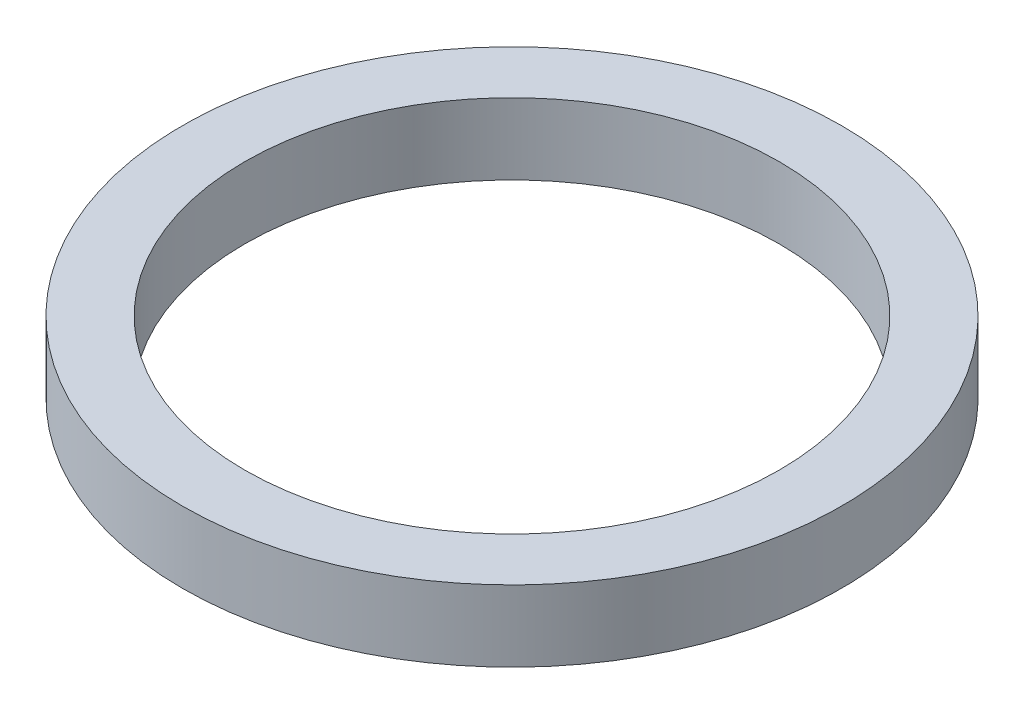
ISO-10303-21;
HEADER;
FILE_DESCRIPTION(('STEP AP214'),'2;1');
FILE_NAME('part.step','',(''),(''),'','','');
FILE_SCHEMA(('AUTOMOTIVE_DESIGN { 1 0 10303 214 1 1 1 1 }'));
ENDSEC;
DATA;
#1=APPLICATION_CONTEXT('core data for automotive mechanical design processes');
#2=APPLICATION_PROTOCOL_DEFINITION('international standard','automotive_design',2000,#1);
#3=PRODUCT_CONTEXT('',#1,'mechanical');
#4=PRODUCT('Part','Part','',(#3));
#5=PRODUCT_RELATED_PRODUCT_CATEGORY('part','',(#4));
#6=PRODUCT_DEFINITION_FORMATION('','',#4);
#7=PRODUCT_DEFINITION_CONTEXT('part definition',#1,'design');
#8=PRODUCT_DEFINITION('design','',#6,#7);
#9=PRODUCT_DEFINITION_SHAPE('','',#8);
#10=(LENGTH_UNIT() NAMED_UNIT(*) SI_UNIT(.MILLI.,.METRE.));
#11=(NAMED_UNIT(*) PLANE_ANGLE_UNIT() SI_UNIT($,.RADIAN.));
#12=(NAMED_UNIT(*) SI_UNIT($,.STERADIAN.) SOLID_ANGLE_UNIT());
#13=UNCERTAINTY_MEASURE_WITH_UNIT(LENGTH_MEASURE(1.E-05),#10,'distance_accuracy_value','');
#14=(GEOMETRIC_REPRESENTATION_CONTEXT(3) GLOBAL_UNCERTAINTY_ASSIGNED_CONTEXT((#13)) GLOBAL_UNIT_ASSIGNED_CONTEXT((#10,
#11,#12)) REPRESENTATION_CONTEXT('',''));
#15=CARTESIAN_POINT('',(0.,0.,0.));
#16=DIRECTION('',(0.,0.,1.));
#17=DIRECTION('',(1.,0.,0.));
#18=AXIS2_PLACEMENT_3D('',#15,#16,#17);
#19=CARTESIAN_POINT('',(0.,4.,0.));
#20=DIRECTION('',(0.,1.,0.));
#21=DIRECTION('',(0.,0.,1.));
#22=AXIS2_PLACEMENT_3D('',#19,#20,#21);
#23=PLANE('',#22);
#24=CARTESIAN_POINT('',(0.,4.,0.));
#25=DIRECTION('',(0.,1.,0.));
#26=DIRECTION('',(0.,0.,1.));
#27=AXIS2_PLACEMENT_3D('',#24,#25,#26);
#28=CIRCLE('',#27,18.5);
#29=CARTESIAN_POINT('',(0.,4.,18.5));
#30=VERTEX_POINT('',#29);
#31=EDGE_CURVE('E10',#30,#30,#28,.T.);
#32=ORIENTED_EDGE('',*,*,#31,.T.);
#33=EDGE_LOOP('',(#32));
#34=FACE_BOUND('',#33,.T.);
#35=CARTESIAN_POINT('',(0.,4.,0.));
#36=DIRECTION('',(0.,1.,0.));
#37=DIRECTION('',(0.,0.,1.));
#38=AXIS2_PLACEMENT_3D('',#35,#36,#37);
#39=CIRCLE('',#38,15.);
#40=CARTESIAN_POINT('',(0.,4.,15.));
#41=VERTEX_POINT('',#40);
#42=EDGE_CURVE('E50',#41,#41,#39,.T.);
#43=ORIENTED_EDGE('',*,*,#42,.F.);
#44=EDGE_LOOP('',(#43));
#45=FACE_BOUND('',#44,.T.);
#46=ADVANCED_FACE('F39',(#34,#45),#23,.T.);
#47=CARTESIAN_POINT('',(0.,0.,0.));
#48=DIRECTION('',(0.,1.,0.));
#49=DIRECTION('',(0.,0.,1.));
#50=AXIS2_PLACEMENT_3D('',#47,#48,#49);
#51=PLANE('',#50);
#52=CARTESIAN_POINT('',(0.,0.,0.));
#53=DIRECTION('',(0.,1.,0.));
#54=DIRECTION('',(0.,0.,1.));
#55=AXIS2_PLACEMENT_3D('',#52,#53,#54);
#56=CIRCLE('',#55,18.5);
#57=CARTESIAN_POINT('',(0.,0.,18.5));
#58=VERTEX_POINT('',#57);
#59=EDGE_CURVE('E43',#58,#58,#56,.T.);
#60=ORIENTED_EDGE('',*,*,#59,.F.);
#61=EDGE_LOOP('',(#60));
#62=FACE_BOUND('',#61,.T.);
#63=CARTESIAN_POINT('',(0.,0.,0.));
#64=DIRECTION('',(0.,1.,0.));
#65=DIRECTION('',(0.,0.,1.));
#66=AXIS2_PLACEMENT_3D('',#63,#64,#65);
#67=CIRCLE('',#66,15.);
#68=CARTESIAN_POINT('',(0.,0.,15.));
#69=VERTEX_POINT('',#68);
#70=EDGE_CURVE('E52',#69,#69,#67,.T.);
#71=ORIENTED_EDGE('',*,*,#70,.T.);
#72=EDGE_LOOP('',(#71));
#73=FACE_BOUND('',#72,.T.);
#74=ADVANCED_FACE('F62',(#62,#73),#51,.F.);
#75=CARTESIAN_POINT('',(0.,4.,0.));
#76=DIRECTION('',(0.,-1.,0.));
#77=DIRECTION('',(0.,0.,-1.));
#78=AXIS2_PLACEMENT_3D('',#75,#76,#77);
#79=CYLINDRICAL_SURFACE('',#78,18.5);
#80=ORIENTED_EDGE('',*,*,#31,.F.);
#81=EDGE_LOOP('',(#80));
#82=FACE_BOUND('',#81,.T.);
#83=ORIENTED_EDGE('',*,*,#59,.T.);
#84=EDGE_LOOP('',(#83));
#85=FACE_BOUND('',#84,.T.);
#86=ADVANCED_FACE('F41',(#82,#85),#79,.T.);
#87=CARTESIAN_POINT('',(0.,4.,0.));
#88=DIRECTION('',(0.,-1.,0.));
#89=DIRECTION('',(0.,0.,-1.));
#90=AXIS2_PLACEMENT_3D('',#87,#88,#89);
#91=CYLINDRICAL_SURFACE('',#90,15.);
#92=ORIENTED_EDGE('',*,*,#42,.T.);
#93=EDGE_LOOP('',(#92));
#94=FACE_BOUND('',#93,.T.);
#95=ORIENTED_EDGE('',*,*,#70,.F.);
#96=EDGE_LOOP('',(#95));
#97=FACE_BOUND('',#96,.T.);
#98=ADVANCED_FACE('F58',(#94,#97),#91,.F.);
#99=CLOSED_SHELL('',(#46,#74,#86,#98));
#100=MANIFOLD_SOLID_BREP('B2',#99);
#101=ADVANCED_BREP_SHAPE_REPRESENTATION('',(#18,#100),#14);
#102=SHAPE_DEFINITION_REPRESENTATION(#9,#101);
ENDSEC;
END-ISO-10303-21;
